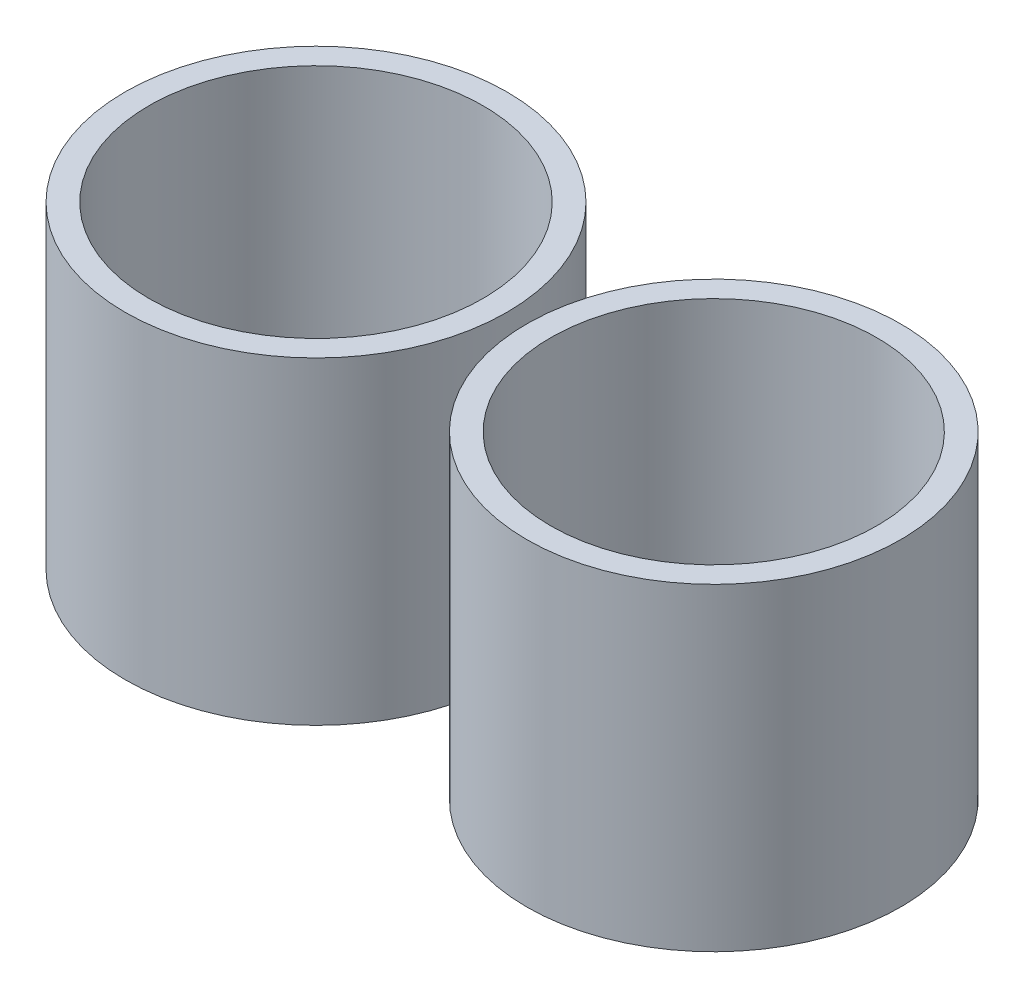
ISO-10303-21;
HEADER;
FILE_DESCRIPTION(('STEP AP214'),'2;1');
FILE_NAME('part.step','',(''),(''),'','','');
FILE_SCHEMA(('AUTOMOTIVE_DESIGN { 1 0 10303 214 1 1 1 1 }'));
ENDSEC;
DATA;
#1=APPLICATION_CONTEXT('core data for automotive mechanical design processes');
#2=APPLICATION_PROTOCOL_DEFINITION('international standard','automotive_design',2000,#1);
#3=PRODUCT_CONTEXT('',#1,'mechanical');
#4=PRODUCT('Part','Part','',(#3));
#5=PRODUCT_RELATED_PRODUCT_CATEGORY('part','',(#4));
#6=PRODUCT_DEFINITION_FORMATION('','',#4);
#7=PRODUCT_DEFINITION_CONTEXT('part definition',#1,'design');
#8=PRODUCT_DEFINITION('design','',#6,#7);
#9=PRODUCT_DEFINITION_SHAPE('','',#8);
#10=(LENGTH_UNIT() NAMED_UNIT(*) SI_UNIT(.MILLI.,.METRE.));
#11=(NAMED_UNIT(*) PLANE_ANGLE_UNIT() SI_UNIT($,.RADIAN.));
#12=(NAMED_UNIT(*) SI_UNIT($,.STERADIAN.) SOLID_ANGLE_UNIT());
#13=UNCERTAINTY_MEASURE_WITH_UNIT(LENGTH_MEASURE(1.E-05),#10,'distance_accuracy_value','');
#14=(GEOMETRIC_REPRESENTATION_CONTEXT(3) GLOBAL_UNCERTAINTY_ASSIGNED_CONTEXT((#13)) GLOBAL_UNIT_ASSIGNED_CONTEXT((#10,
#11,#12)) REPRESENTATION_CONTEXT('',''));
#15=CARTESIAN_POINT('',(0.,0.,0.));
#16=DIRECTION('',(0.,0.,1.));
#17=DIRECTION('',(1.,0.,0.));
#18=AXIS2_PLACEMENT_3D('',#15,#16,#17);
#19=CARTESIAN_POINT('',(-25.,20.,0.));
#20=DIRECTION('',(0.,-1.,0.));
#21=DIRECTION('',(0.,0.,-1.));
#22=AXIS2_PLACEMENT_3D('',#19,#20,#21);
#23=CYLINDRICAL_SURFACE('',#22,12.);
#24=CARTESIAN_POINT('',(-25.,20.,0.));
#25=DIRECTION('',(0.,1.,0.));
#26=DIRECTION('',(0.,0.,1.));
#27=AXIS2_PLACEMENT_3D('',#24,#25,#26);
#28=CIRCLE('',#27,12.);
#29=CARTESIAN_POINT('',(-25.,20.,12.));
#30=VERTEX_POINT('',#29);
#31=EDGE_CURVE('E11',#30,#30,#28,.T.);
#32=ORIENTED_EDGE('',*,*,#31,.F.);
#33=EDGE_LOOP('',(#32));
#34=FACE_BOUND('',#33,.T.);
#35=CARTESIAN_POINT('',(-25.,0.,0.));
#36=DIRECTION('',(0.,1.,0.));
#37=DIRECTION('',(0.,0.,1.));
#38=AXIS2_PLACEMENT_3D('',#35,#36,#37);
#39=CIRCLE('',#38,12.);
#40=CARTESIAN_POINT('',(-25.,0.,12.));
#41=VERTEX_POINT('',#40);
#42=EDGE_CURVE('E42',#41,#41,#39,.T.);
#43=ORIENTED_EDGE('',*,*,#42,.T.);
#44=EDGE_LOOP('',(#43));
#45=FACE_BOUND('',#44,.T.);
#46=ADVANCED_FACE('F39',(#34,#45),#23,.T.);
#47=CARTESIAN_POINT('',(-25.,20.,0.));
#48=DIRECTION('',(0.,1.,0.));
#49=DIRECTION('',(0.,0.,1.));
#50=AXIS2_PLACEMENT_3D('',#47,#48,#49);
#51=PLANE('',#50);
#52=CARTESIAN_POINT('',(-25.,20.,0.));
#53=DIRECTION('',(0.,1.,0.));
#54=DIRECTION('',(0.,0.,1.));
#55=AXIS2_PLACEMENT_3D('',#52,#53,#54);
#56=CIRCLE('',#55,10.5);
#57=CARTESIAN_POINT('',(-25.,20.,10.5));
#58=VERTEX_POINT('',#57);
#59=EDGE_CURVE('E49',#58,#58,#56,.T.);
#60=ORIENTED_EDGE('',*,*,#59,.F.);
#61=EDGE_LOOP('',(#60));
#62=FACE_BOUND('',#61,.T.);
#63=ORIENTED_EDGE('',*,*,#31,.T.);
#64=EDGE_LOOP('',(#63));
#65=FACE_BOUND('',#64,.T.);
#66=ADVANCED_FACE('F67',(#62,#65),#51,.T.);
#67=CARTESIAN_POINT('',(-25.,0.,0.));
#68=DIRECTION('',(0.,1.,0.));
#69=DIRECTION('',(0.,0.,1.));
#70=AXIS2_PLACEMENT_3D('',#67,#68,#69);
#71=PLANE('',#70);
#72=CARTESIAN_POINT('',(-25.,0.,0.));
#73=DIRECTION('',(0.,1.,0.));
#74=DIRECTION('',(0.,0.,1.));
#75=AXIS2_PLACEMENT_3D('',#72,#73,#74);
#76=CIRCLE('',#75,10.5);
#77=CARTESIAN_POINT('',(-25.,0.,10.5));
#78=VERTEX_POINT('',#77);
#79=EDGE_CURVE('E53',#78,#78,#76,.T.);
#80=ORIENTED_EDGE('',*,*,#79,.T.);
#81=EDGE_LOOP('',(#80));
#82=FACE_BOUND('',#81,.T.);
#83=ORIENTED_EDGE('',*,*,#42,.F.);
#84=EDGE_LOOP('',(#83));
#85=FACE_BOUND('',#84,.T.);
#86=ADVANCED_FACE('F57',(#82,#85),#71,.F.);
#87=CARTESIAN_POINT('',(-25.,0.,0.));
#88=DIRECTION('',(0.,1.,0.));
#89=DIRECTION('',(0.,0.,1.));
#90=AXIS2_PLACEMENT_3D('',#87,#88,#89);
#91=CYLINDRICAL_SURFACE('',#90,10.5);
#92=ORIENTED_EDGE('',*,*,#59,.T.);
#93=EDGE_LOOP('',(#92));
#94=FACE_BOUND('',#93,.T.);
#95=ORIENTED_EDGE('',*,*,#79,.F.);
#96=EDGE_LOOP('',(#95));
#97=FACE_BOUND('',#96,.T.);
#98=ADVANCED_FACE('F60',(#94,#97),#91,.F.);
#99=CLOSED_SHELL('',(#46,#66,#86,#98));
#100=MANIFOLD_SOLID_BREP('B2',#99);
#101=CARTESIAN_POINT('',(0.,20.,0.));
#102=DIRECTION('',(0.,-1.,0.));
#103=DIRECTION('',(0.,0.,-1.));
#104=AXIS2_PLACEMENT_3D('',#101,#102,#103);
#105=CYLINDRICAL_SURFACE('',#104,11.75);
#106=CARTESIAN_POINT('',(0.,20.,0.));
#107=DIRECTION('',(0.,1.,0.));
#108=DIRECTION('',(0.,0.,1.));
#109=AXIS2_PLACEMENT_3D('',#106,#107,#108);
#110=CIRCLE('',#109,11.75);
#111=CARTESIAN_POINT('',(0.,20.,11.75));
#112=VERTEX_POINT('',#111);
#113=EDGE_CURVE('E38',#112,#112,#110,.T.);
#114=ORIENTED_EDGE('',*,*,#113,.F.);
#115=EDGE_LOOP('',(#114));
#116=FACE_BOUND('',#115,.T.);
#117=CARTESIAN_POINT('',(0.,0.,0.));
#118=DIRECTION('',(0.,1.,0.));
#119=DIRECTION('',(0.,0.,1.));
#120=AXIS2_PLACEMENT_3D('',#117,#118,#119);
#121=CIRCLE('',#120,11.75);
#122=CARTESIAN_POINT('',(0.,0.,11.75));
#123=VERTEX_POINT('',#122);
#124=EDGE_CURVE('E104',#123,#123,#121,.T.);
#125=ORIENTED_EDGE('',*,*,#124,.T.);
#126=EDGE_LOOP('',(#125));
#127=FACE_BOUND('',#126,.T.);
#128=ADVANCED_FACE('F101',(#116,#127),#105,.T.);
#129=CARTESIAN_POINT('',(0.,20.,0.));
#130=DIRECTION('',(0.,1.,0.));
#131=DIRECTION('',(0.,0.,1.));
#132=AXIS2_PLACEMENT_3D('',#129,#130,#131);
#133=PLANE('',#132);
#134=CARTESIAN_POINT('',(0.,20.,0.));
#135=DIRECTION('',(0.,1.,0.));
#136=DIRECTION('',(0.,0.,1.));
#137=AXIS2_PLACEMENT_3D('',#134,#135,#136);
#138=CIRCLE('',#137,10.25);
#139=CARTESIAN_POINT('',(0.,20.,10.25));
#140=VERTEX_POINT('',#139);
#141=EDGE_CURVE('E111',#140,#140,#138,.T.);
#142=ORIENTED_EDGE('',*,*,#141,.F.);
#143=EDGE_LOOP('',(#142));
#144=FACE_BOUND('',#143,.T.);
#145=ORIENTED_EDGE('',*,*,#113,.T.);
#146=EDGE_LOOP('',(#145));
#147=FACE_BOUND('',#146,.T.);
#148=ADVANCED_FACE('F129',(#144,#147),#133,.T.);
#149=CARTESIAN_POINT('',(0.,0.,0.));
#150=DIRECTION('',(0.,1.,0.));
#151=DIRECTION('',(0.,0.,1.));
#152=AXIS2_PLACEMENT_3D('',#149,#150,#151);
#153=PLANE('',#152);
#154=CARTESIAN_POINT('',(0.,0.,0.));
#155=DIRECTION('',(0.,1.,0.));
#156=DIRECTION('',(0.,0.,1.));
#157=AXIS2_PLACEMENT_3D('',#154,#155,#156);
#158=CIRCLE('',#157,10.25);
#159=CARTESIAN_POINT('',(0.,0.,10.25));
#160=VERTEX_POINT('',#159);
#161=EDGE_CURVE('E115',#160,#160,#158,.T.);
#162=ORIENTED_EDGE('',*,*,#161,.T.);
#163=EDGE_LOOP('',(#162));
#164=FACE_BOUND('',#163,.T.);
#165=ORIENTED_EDGE('',*,*,#124,.F.);
#166=EDGE_LOOP('',(#165));
#167=FACE_BOUND('',#166,.T.);
#168=ADVANCED_FACE('F119',(#164,#167),#153,.F.);
#169=CARTESIAN_POINT('',(0.,0.,0.));
#170=DIRECTION('',(0.,1.,0.));
#171=DIRECTION('',(0.,0.,1.));
#172=AXIS2_PLACEMENT_3D('',#169,#170,#171);
#173=CYLINDRICAL_SURFACE('',#172,10.25);
#174=ORIENTED_EDGE('',*,*,#141,.T.);
#175=EDGE_LOOP('',(#174));
#176=FACE_BOUND('',#175,.T.);
#177=ORIENTED_EDGE('',*,*,#161,.F.);
#178=EDGE_LOOP('',(#177));
#179=FACE_BOUND('',#178,.T.);
#180=ADVANCED_FACE('F122',(#176,#179),#173,.F.);
#181=CLOSED_SHELL('',(#128,#148,#168,#180));
#182=MANIFOLD_SOLID_BREP('B6',#181);
#183=ADVANCED_BREP_SHAPE_REPRESENTATION('',(#18,#100,#182),#14);
#184=SHAPE_DEFINITION_REPRESENTATION(#9,#183);
ENDSEC;
END-ISO-10303-21;
